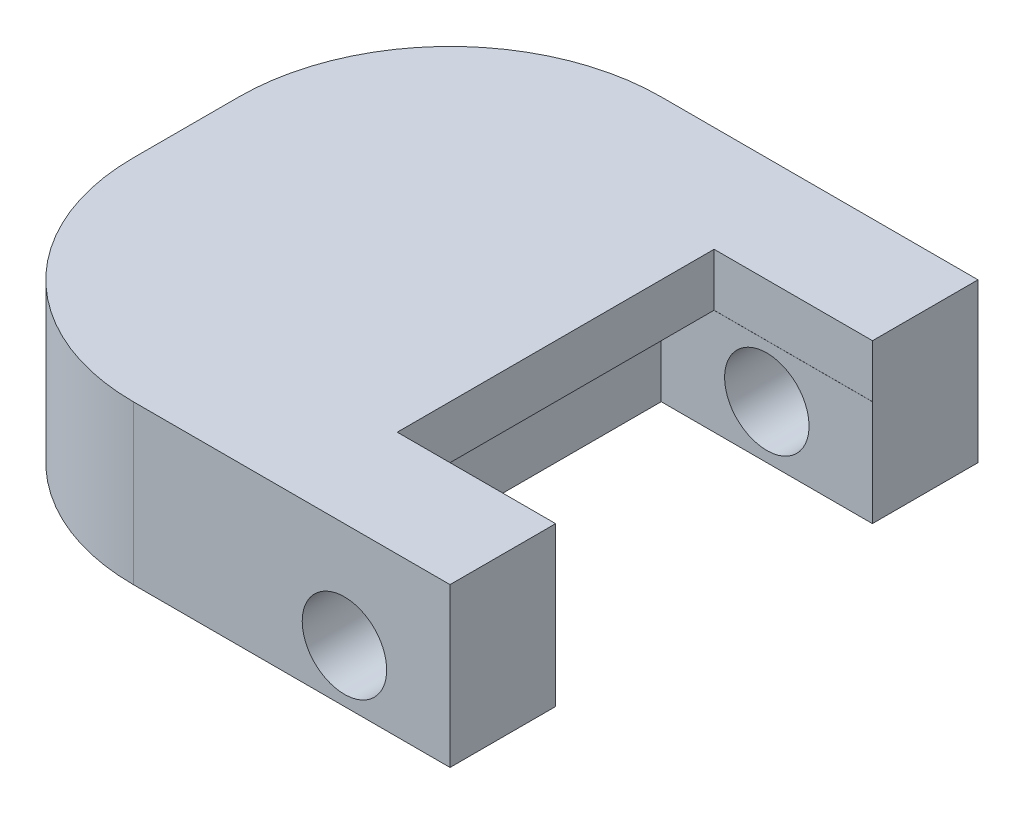
ISO-10303-21;
HEADER;
FILE_DESCRIPTION(('STEP AP214'),'2;1');
FILE_NAME('part.step','',(''),(''),'','','');
FILE_SCHEMA(('AUTOMOTIVE_DESIGN { 1 0 10303 214 1 1 1 1 }'));
ENDSEC;
DATA;
#1=APPLICATION_CONTEXT('core data for automotive mechanical design processes');
#2=APPLICATION_PROTOCOL_DEFINITION('international standard','automotive_design',2000,#1);
#3=PRODUCT_CONTEXT('',#1,'mechanical');
#4=PRODUCT('Part','Part','',(#3));
#5=PRODUCT_RELATED_PRODUCT_CATEGORY('part','',(#4));
#6=PRODUCT_DEFINITION_FORMATION('','',#4);
#7=PRODUCT_DEFINITION_CONTEXT('part definition',#1,'design');
#8=PRODUCT_DEFINITION('design','',#6,#7);
#9=PRODUCT_DEFINITION_SHAPE('','',#8);
#10=(LENGTH_UNIT() NAMED_UNIT(*) SI_UNIT(.MILLI.,.METRE.));
#11=(NAMED_UNIT(*) PLANE_ANGLE_UNIT() SI_UNIT($,.RADIAN.));
#12=(NAMED_UNIT(*) SI_UNIT($,.STERADIAN.) SOLID_ANGLE_UNIT());
#13=UNCERTAINTY_MEASURE_WITH_UNIT(LENGTH_MEASURE(1.E-05),#10,'distance_accuracy_value','');
#14=(GEOMETRIC_REPRESENTATION_CONTEXT(3) GLOBAL_UNCERTAINTY_ASSIGNED_CONTEXT((#13)) GLOBAL_UNIT_ASSIGNED_CONTEXT((#10,
#11,#12)) REPRESENTATION_CONTEXT('',''));
#15=CARTESIAN_POINT('',(0.,0.,0.));
#16=DIRECTION('',(0.,0.,1.));
#17=DIRECTION('',(1.,0.,0.));
#18=AXIS2_PLACEMENT_3D('',#15,#16,#17);
#19=CARTESIAN_POINT('',(63.5,38.1,-63.5));
#20=DIRECTION('',(-1.,0.,0.));
#21=DIRECTION('',(0.,0.,1.));
#22=AXIS2_PLACEMENT_3D('',#19,#20,#21);
#23=PLANE('',#22);
#24=DIRECTION('',(0.,-1.,0.));
#25=VECTOR('',#24,1.);
#26=CARTESIAN_POINT('',(63.5,25.4,38.1));
#27=LINE('',#26,#25);
#28=CARTESIAN_POINT('',(63.5,38.1,38.1));
#29=VERTEX_POINT('',#28);
#30=CARTESIAN_POINT('',(63.5,0.,38.1));
#31=VERTEX_POINT('',#30);
#32=EDGE_CURVE('E180',#29,#31,#27,.T.);
#33=ORIENTED_EDGE('',*,*,#32,.F.);
#34=DIRECTION('',(0.,0.,-1.));
#35=VECTOR('',#34,1.);
#36=CARTESIAN_POINT('',(63.5,38.1,-63.5));
#37=LINE('',#36,#35);
#38=CARTESIAN_POINT('',(63.5,38.1,63.5));
#39=VERTEX_POINT('',#38);
#40=EDGE_CURVE('E194',#39,#29,#37,.T.);
#41=ORIENTED_EDGE('',*,*,#40,.F.);
#42=DIRECTION('',(0.,-1.,0.));
#43=VECTOR('',#42,1.);
#44=CARTESIAN_POINT('',(63.5,38.1,63.5));
#45=LINE('',#44,#43);
#46=CARTESIAN_POINT('',(63.5,0.,63.5));
#47=VERTEX_POINT('',#46);
#48=EDGE_CURVE('E208',#39,#47,#45,.T.);
#49=ORIENTED_EDGE('',*,*,#48,.T.);
#50=DIRECTION('',(0.,0.,-1.));
#51=VECTOR('',#50,1.);
#52=CARTESIAN_POINT('',(63.5,0.,-63.5));
#53=LINE('',#52,#51);
#54=EDGE_CURVE('E209',#47,#31,#53,.T.);
#55=ORIENTED_EDGE('',*,*,#54,.T.);
#56=EDGE_LOOP('',(#33,#41,#49,#55));
#57=FACE_BOUND('',#56,.T.);
#58=ADVANCED_FACE('F36',(#57),#23,.F.);
#59=CARTESIAN_POINT('',(63.5,38.1,-38.123232364424));
#60=VERTEX_POINT('',#59);
#61=CARTESIAN_POINT('',(63.5,38.1,-63.5));
#62=VERTEX_POINT('',#61);
#63=EDGE_CURVE('E198',#60,#62,#37,.T.);
#64=ORIENTED_EDGE('',*,*,#63,.F.);
#65=DIRECTION('',(0.,1.,0.));
#66=VECTOR('',#65,1.);
#67=CARTESIAN_POINT('',(63.5,25.4,-38.123232364424));
#68=LINE('',#67,#66);
#69=CARTESIAN_POINT('',(63.5,25.4,-38.123232364424));
#70=VERTEX_POINT('',#69);
#71=EDGE_CURVE('E161',#70,#60,#68,.T.);
#72=ORIENTED_EDGE('',*,*,#71,.F.);
#73=DIRECTION('',(0.,0.,-1.));
#74=VECTOR('',#73,1.);
#75=CARTESIAN_POINT('',(63.5,25.4,38.1));
#76=LINE('',#75,#74);
#77=CARTESIAN_POINT('',(63.5,25.4,-38.1));
#78=VERTEX_POINT('',#77);
#79=EDGE_CURVE('E148',#78,#70,#76,.T.);
#80=ORIENTED_EDGE('',*,*,#79,.F.);
#81=DIRECTION('',(0.,1.,0.));
#82=VECTOR('',#81,1.);
#83=CARTESIAN_POINT('',(63.5,25.4,-38.1));
#84=LINE('',#83,#82);
#85=CARTESIAN_POINT('',(63.5,0.,-38.1));
#86=VERTEX_POINT('',#85);
#87=EDGE_CURVE('E176',#86,#78,#84,.T.);
#88=ORIENTED_EDGE('',*,*,#87,.F.);
#89=CARTESIAN_POINT('',(63.5,0.,-63.5));
#90=VERTEX_POINT('',#89);
#91=EDGE_CURVE('E190',#86,#90,#53,.T.);
#92=ORIENTED_EDGE('',*,*,#91,.T.);
#93=DIRECTION('',(0.,-1.,0.));
#94=VECTOR('',#93,1.);
#95=CARTESIAN_POINT('',(63.5,38.1,-63.5));
#96=LINE('',#95,#94);
#97=EDGE_CURVE('E236',#62,#90,#96,.T.);
#98=ORIENTED_EDGE('',*,*,#97,.F.);
#99=EDGE_LOOP('',(#64,#72,#80,#88,#92,#98));
#100=FACE_BOUND('',#99,.T.);
#101=ADVANCED_FACE('F38',(#100),#23,.F.);
#102=CARTESIAN_POINT('',(63.5,38.1,-63.5));
#103=DIRECTION('',(0.,0.,1.));
#104=DIRECTION('',(1.,0.,0.));
#105=AXIS2_PLACEMENT_3D('',#102,#103,#104);
#106=PLANE('',#105);
#107=CARTESIAN_POINT('',(38.1,12.7,-63.5));
#108=DIRECTION('',(0.,0.,-1.));
#109=DIRECTION('',(-1.,0.,0.));
#110=AXIS2_PLACEMENT_3D('',#107,#108,#109);
#111=CIRCLE('',#110,10.16);
#112=CARTESIAN_POINT('',(27.94,12.7,-63.5));
#113=VERTEX_POINT('',#112);
#114=EDGE_CURVE('E166',#113,#113,#111,.T.);
#115=ORIENTED_EDGE('',*,*,#114,.F.);
#116=EDGE_LOOP('',(#115));
#117=FACE_BOUND('',#116,.T.);
#118=DIRECTION('',(-1.,0.,0.));
#119=VECTOR('',#118,1.);
#120=CARTESIAN_POINT('',(63.5,0.,-63.5));
#121=LINE('',#120,#119);
#122=CARTESIAN_POINT('',(-12.7,0.,-63.5));
#123=VERTEX_POINT('',#122);
#124=EDGE_CURVE('E212',#90,#123,#121,.T.);
#125=ORIENTED_EDGE('',*,*,#124,.T.);
#126=DIRECTION('',(0.,-1.,0.));
#127=VECTOR('',#126,1.);
#128=CARTESIAN_POINT('',(-12.7,38.1,-63.5));
#129=LINE('',#128,#127);
#130=CARTESIAN_POINT('',(-12.7,38.1,-63.5));
#131=VERTEX_POINT('',#130);
#132=EDGE_CURVE('E233',#131,#123,#129,.T.);
#133=ORIENTED_EDGE('',*,*,#132,.F.);
#134=DIRECTION('',(-1.,0.,0.));
#135=VECTOR('',#134,1.);
#136=CARTESIAN_POINT('',(63.5,38.1,-63.5));
#137=LINE('',#136,#135);
#138=EDGE_CURVE('E197',#62,#131,#137,.T.);
#139=ORIENTED_EDGE('',*,*,#138,.F.);
#140=ORIENTED_EDGE('',*,*,#97,.T.);
#141=EDGE_LOOP('',(#125,#133,#139,#140));
#142=FACE_BOUND('',#141,.T.);
#143=ADVANCED_FACE('F288',(#117,#142),#106,.F.);
#144=CARTESIAN_POINT('',(-12.7,38.1,-12.7));
#145=DIRECTION('',(0.,-1.,0.));
#146=DIRECTION('',(0.,0.,-1.));
#147=AXIS2_PLACEMENT_3D('',#144,#145,#146);
#148=CYLINDRICAL_SURFACE('',#147,50.8);
#149=CARTESIAN_POINT('',(-12.7,0.,-12.7));
#150=DIRECTION('',(0.,1.,0.));
#151=DIRECTION('',(0.,0.,1.));
#152=AXIS2_PLACEMENT_3D('',#149,#150,#151);
#153=CIRCLE('',#152,50.8);
#154=CARTESIAN_POINT('',(-63.5,0.,-12.7));
#155=VERTEX_POINT('',#154);
#156=EDGE_CURVE('E214',#123,#155,#153,.T.);
#157=ORIENTED_EDGE('',*,*,#156,.T.);
#158=DIRECTION('',(0.,-1.,0.));
#159=VECTOR('',#158,1.);
#160=CARTESIAN_POINT('',(-63.5,38.1,-12.7));
#161=LINE('',#160,#159);
#162=CARTESIAN_POINT('',(-63.5,38.1,-12.7));
#163=VERTEX_POINT('',#162);
#164=EDGE_CURVE('E230',#163,#155,#161,.T.);
#165=ORIENTED_EDGE('',*,*,#164,.F.);
#166=CARTESIAN_POINT('',(-12.7,38.1,-12.7));
#167=DIRECTION('',(0.,1.,0.));
#168=DIRECTION('',(0.,0.,1.));
#169=AXIS2_PLACEMENT_3D('',#166,#167,#168);
#170=CIRCLE('',#169,50.8);
#171=EDGE_CURVE('E200',#131,#163,#170,.T.);
#172=ORIENTED_EDGE('',*,*,#171,.F.);
#173=ORIENTED_EDGE('',*,*,#132,.T.);
#174=EDGE_LOOP('',(#157,#165,#172,#173));
#175=FACE_BOUND('',#174,.T.);
#176=ADVANCED_FACE('F283',(#175),#148,.T.);
#177=CARTESIAN_POINT('',(-63.5,38.1,-12.7));
#178=DIRECTION('',(1.,0.,0.));
#179=DIRECTION('',(0.,0.,-1.));
#180=AXIS2_PLACEMENT_3D('',#177,#178,#179);
#181=PLANE('',#180);
#182=DIRECTION('',(0.,0.,1.));
#183=VECTOR('',#182,1.);
#184=CARTESIAN_POINT('',(-63.5,0.,-12.7));
#185=LINE('',#184,#183);
#186=CARTESIAN_POINT('',(-63.5,0.,12.7));
#187=VERTEX_POINT('',#186);
#188=EDGE_CURVE('E216',#155,#187,#185,.T.);
#189=ORIENTED_EDGE('',*,*,#188,.T.);
#190=DIRECTION('',(0.,-1.,0.));
#191=VECTOR('',#190,1.);
#192=CARTESIAN_POINT('',(-63.5,38.1,12.7));
#193=LINE('',#192,#191);
#194=CARTESIAN_POINT('',(-63.5,38.1,12.7));
#195=VERTEX_POINT('',#194);
#196=EDGE_CURVE('E227',#195,#187,#193,.T.);
#197=ORIENTED_EDGE('',*,*,#196,.F.);
#198=DIRECTION('',(0.,0.,1.));
#199=VECTOR('',#198,1.);
#200=CARTESIAN_POINT('',(-63.5,38.1,-12.7));
#201=LINE('',#200,#199);
#202=EDGE_CURVE('E202',#163,#195,#201,.T.);
#203=ORIENTED_EDGE('',*,*,#202,.F.);
#204=ORIENTED_EDGE('',*,*,#164,.T.);
#205=EDGE_LOOP('',(#189,#197,#203,#204));
#206=FACE_BOUND('',#205,.T.);
#207=ADVANCED_FACE('F278',(#206),#181,.F.);
#208=CARTESIAN_POINT('',(-12.7,38.1,12.7));
#209=DIRECTION('',(0.,-1.,0.));
#210=DIRECTION('',(0.,0.,-1.));
#211=AXIS2_PLACEMENT_3D('',#208,#209,#210);
#212=CYLINDRICAL_SURFACE('',#211,50.8);
#213=CARTESIAN_POINT('',(-12.7,0.,12.7));
#214=DIRECTION('',(0.,1.,0.));
#215=DIRECTION('',(0.,0.,-1.));
#216=AXIS2_PLACEMENT_3D('',#213,#214,#215);
#217=CIRCLE('',#216,50.8);
#218=CARTESIAN_POINT('',(-12.7,0.,63.5));
#219=VERTEX_POINT('',#218);
#220=EDGE_CURVE('E218',#187,#219,#217,.T.);
#221=ORIENTED_EDGE('',*,*,#220,.T.);
#222=DIRECTION('',(0.,-1.,0.));
#223=VECTOR('',#222,1.);
#224=CARTESIAN_POINT('',(-12.7,38.1,63.5));
#225=LINE('',#224,#223);
#226=CARTESIAN_POINT('',(-12.7,38.1,63.5));
#227=VERTEX_POINT('',#226);
#228=EDGE_CURVE('E224',#227,#219,#225,.T.);
#229=ORIENTED_EDGE('',*,*,#228,.F.);
#230=CARTESIAN_POINT('',(-12.7,38.1,12.7));
#231=DIRECTION('',(0.,1.,0.));
#232=DIRECTION('',(0.,0.,-1.));
#233=AXIS2_PLACEMENT_3D('',#230,#231,#232);
#234=CIRCLE('',#233,50.8);
#235=EDGE_CURVE('E204',#195,#227,#234,.T.);
#236=ORIENTED_EDGE('',*,*,#235,.F.);
#237=ORIENTED_EDGE('',*,*,#196,.T.);
#238=EDGE_LOOP('',(#221,#229,#236,#237));
#239=FACE_BOUND('',#238,.T.);
#240=ADVANCED_FACE('F274',(#239),#212,.T.);
#241=CARTESIAN_POINT('',(63.5,38.1,63.5));
#242=DIRECTION('',(0.,0.,-1.));
#243=DIRECTION('',(-1.,0.,0.));
#244=AXIS2_PLACEMENT_3D('',#241,#242,#243);
#245=PLANE('',#244);
#246=CARTESIAN_POINT('',(38.1,12.7,63.5));
#247=DIRECTION('',(0.,0.,-1.));
#248=DIRECTION('',(-1.,0.,0.));
#249=AXIS2_PLACEMENT_3D('',#246,#247,#248);
#250=CIRCLE('',#249,10.16);
#251=CARTESIAN_POINT('',(27.94,12.7,63.5));
#252=VERTEX_POINT('',#251);
#253=EDGE_CURVE('E170',#252,#252,#250,.T.);
#254=ORIENTED_EDGE('',*,*,#253,.T.);
#255=EDGE_LOOP('',(#254));
#256=FACE_BOUND('',#255,.T.);
#257=DIRECTION('',(1.,0.,0.));
#258=VECTOR('',#257,1.);
#259=CARTESIAN_POINT('',(63.5,0.,63.5));
#260=LINE('',#259,#258);
#261=EDGE_CURVE('E220',#219,#47,#260,.T.);
#262=ORIENTED_EDGE('',*,*,#261,.T.);
#263=ORIENTED_EDGE('',*,*,#48,.F.);
#264=DIRECTION('',(1.,0.,0.));
#265=VECTOR('',#264,1.);
#266=CARTESIAN_POINT('',(63.5,38.1,63.5));
#267=LINE('',#266,#265);
#268=EDGE_CURVE('E206',#227,#39,#267,.T.);
#269=ORIENTED_EDGE('',*,*,#268,.F.);
#270=ORIENTED_EDGE('',*,*,#228,.T.);
#271=EDGE_LOOP('',(#262,#263,#269,#270));
#272=FACE_BOUND('',#271,.T.);
#273=ADVANCED_FACE('F270',(#256,#272),#245,.F.);
#274=CARTESIAN_POINT('',(-12.7,38.1,12.7));
#275=DIRECTION('',(0.,-1.,0.));
#276=DIRECTION('',(0.,0.,-1.));
#277=AXIS2_PLACEMENT_3D('',#274,#275,#276);
#278=PLANE('',#277);
#279=ORIENTED_EDGE('',*,*,#40,.T.);
#280=DIRECTION('',(1.,0.,0.));
#281=VECTOR('',#280,1.);
#282=CARTESIAN_POINT('',(25.4,38.1,38.1));
#283=LINE('',#282,#281);
#284=CARTESIAN_POINT('',(25.4,38.1,38.1));
#285=VERTEX_POINT('',#284);
#286=EDGE_CURVE('E163',#285,#29,#283,.T.);
#287=ORIENTED_EDGE('',*,*,#286,.F.);
#288=DIRECTION('',(0.,0.,1.));
#289=VECTOR('',#288,1.);
#290=CARTESIAN_POINT('',(25.4,38.1,38.1));
#291=LINE('',#290,#289);
#292=CARTESIAN_POINT('',(25.4,38.1,-38.123232364424));
#293=VERTEX_POINT('',#292);
#294=EDGE_CURVE('E152',#293,#285,#291,.T.);
#295=ORIENTED_EDGE('',*,*,#294,.F.);
#296=DIRECTION('',(1.,0.,0.));
#297=VECTOR('',#296,1.);
#298=CARTESIAN_POINT('',(25.4,38.1,-38.123232364424));
#299=LINE('',#298,#297);
#300=EDGE_CURVE('E151',#293,#60,#299,.T.);
#301=ORIENTED_EDGE('',*,*,#300,.T.);
#302=ORIENTED_EDGE('',*,*,#63,.T.);
#303=ORIENTED_EDGE('',*,*,#138,.T.);
#304=ORIENTED_EDGE('',*,*,#171,.T.);
#305=ORIENTED_EDGE('',*,*,#202,.T.);
#306=ORIENTED_EDGE('',*,*,#235,.T.);
#307=ORIENTED_EDGE('',*,*,#268,.T.);
#308=EDGE_LOOP('',(#279,#287,#295,#301,#302,#303,#304,#305,#306,#307));
#309=FACE_BOUND('',#308,.T.);
#310=ADVANCED_FACE('F261',(#309),#278,.F.);
#311=CARTESIAN_POINT('',(-12.7,0.,12.7));
#312=DIRECTION('',(0.,-1.,0.));
#313=DIRECTION('',(0.,0.,-1.));
#314=AXIS2_PLACEMENT_3D('',#311,#312,#313);
#315=PLANE('',#314);
#316=DIRECTION('',(1.,0.,0.));
#317=VECTOR('',#316,1.);
#318=CARTESIAN_POINT('',(-12.7,0.,-38.1));
#319=LINE('',#318,#317);
#320=CARTESIAN_POINT('',(12.7,0.,-38.1));
#321=VERTEX_POINT('',#320);
#322=EDGE_CURVE('E11',#321,#86,#319,.T.);
#323=ORIENTED_EDGE('',*,*,#322,.F.);
#324=DIRECTION('',(0.,0.,1.));
#325=VECTOR('',#324,1.);
#326=CARTESIAN_POINT('',(12.7,0.,12.7));
#327=LINE('',#326,#325);
#328=CARTESIAN_POINT('',(12.7,0.,38.1));
#329=VERTEX_POINT('',#328);
#330=EDGE_CURVE('E239',#321,#329,#327,.T.);
#331=ORIENTED_EDGE('',*,*,#330,.T.);
#332=DIRECTION('',(-1.,0.,0.));
#333=VECTOR('',#332,1.);
#334=CARTESIAN_POINT('',(-12.7,0.,38.1));
#335=LINE('',#334,#333);
#336=EDGE_CURVE('E45',#31,#329,#335,.T.);
#337=ORIENTED_EDGE('',*,*,#336,.F.);
#338=ORIENTED_EDGE('',*,*,#54,.F.);
#339=ORIENTED_EDGE('',*,*,#261,.F.);
#340=ORIENTED_EDGE('',*,*,#220,.F.);
#341=ORIENTED_EDGE('',*,*,#188,.F.);
#342=ORIENTED_EDGE('',*,*,#156,.F.);
#343=ORIENTED_EDGE('',*,*,#124,.F.);
#344=ORIENTED_EDGE('',*,*,#91,.F.);
#345=EDGE_LOOP('',(#323,#331,#337,#338,#339,#340,#341,#342,#343,#344));
#346=FACE_BOUND('',#345,.T.);
#347=ADVANCED_FACE('F248',(#346),#315,.T.);
#348=CARTESIAN_POINT('',(12.7,25.4,-38.1));
#349=DIRECTION('',(0.,0.,-1.));
#350=DIRECTION('',(-1.,0.,0.));
#351=AXIS2_PLACEMENT_3D('',#348,#349,#350);
#352=PLANE('',#351);
#353=CARTESIAN_POINT('',(38.1,12.7,-38.1));
#354=DIRECTION('',(0.,0.,-1.));
#355=DIRECTION('',(-1.,0.,0.));
#356=AXIS2_PLACEMENT_3D('',#353,#354,#355);
#357=CIRCLE('',#356,10.16);
#358=CARTESIAN_POINT('',(27.94,12.7,-38.1));
#359=VERTEX_POINT('',#358);
#360=EDGE_CURVE('E173',#359,#359,#357,.T.);
#361=ORIENTED_EDGE('',*,*,#360,.T.);
#362=EDGE_LOOP('',(#361));
#363=FACE_BOUND('',#362,.T.);
#364=ORIENTED_EDGE('',*,*,#322,.T.);
#365=ORIENTED_EDGE('',*,*,#87,.T.);
#366=DIRECTION('',(1.,0.,0.));
#367=VECTOR('',#366,1.);
#368=CARTESIAN_POINT('',(12.7,25.4,-38.1));
#369=LINE('',#368,#367);
#370=CARTESIAN_POINT('',(25.4,25.4,-38.1));
#371=VERTEX_POINT('',#370);
#372=EDGE_CURVE('E183',#371,#78,#369,.T.);
#373=ORIENTED_EDGE('',*,*,#372,.F.);
#374=CARTESIAN_POINT('',(12.7,25.4,-38.1));
#375=VERTEX_POINT('',#374);
#376=EDGE_CURVE('E191',#375,#371,#369,.T.);
#377=ORIENTED_EDGE('',*,*,#376,.F.);
#378=DIRECTION('',(0.,1.,0.));
#379=VECTOR('',#378,1.);
#380=CARTESIAN_POINT('',(12.7,25.4,-38.1));
#381=LINE('',#380,#379);
#382=EDGE_CURVE('E177',#321,#375,#381,.T.);
#383=ORIENTED_EDGE('',*,*,#382,.F.);
#384=EDGE_LOOP('',(#364,#365,#373,#377,#383));
#385=FACE_BOUND('',#384,.T.);
#386=ADVANCED_FACE('F254',(#363,#385),#352,.F.);
#387=CARTESIAN_POINT('',(12.7,25.4,38.1));
#388=DIRECTION('',(0.,0.,1.));
#389=DIRECTION('',(1.,0.,0.));
#390=AXIS2_PLACEMENT_3D('',#387,#388,#389);
#391=PLANE('',#390);
#392=CARTESIAN_POINT('',(38.1,12.7,38.1));
#393=DIRECTION('',(0.,0.,1.));
#394=DIRECTION('',(1.,0.,0.));
#395=AXIS2_PLACEMENT_3D('',#392,#393,#394);
#396=CIRCLE('',#395,10.16);
#397=CARTESIAN_POINT('',(48.26,12.7,38.1));
#398=VERTEX_POINT('',#397);
#399=EDGE_CURVE('E40',#398,#398,#396,.T.);
#400=ORIENTED_EDGE('',*,*,#399,.T.);
#401=EDGE_LOOP('',(#400));
#402=FACE_BOUND('',#401,.T.);
#403=ORIENTED_EDGE('',*,*,#336,.T.);
#404=DIRECTION('',(0.,-1.,0.));
#405=VECTOR('',#404,1.);
#406=CARTESIAN_POINT('',(12.7,25.4,38.1));
#407=LINE('',#406,#405);
#408=CARTESIAN_POINT('',(12.7,25.4,38.1));
#409=VERTEX_POINT('',#408);
#410=EDGE_CURVE('E60',#409,#329,#407,.T.);
#411=ORIENTED_EDGE('',*,*,#410,.F.);
#412=DIRECTION('',(1.,0.,0.));
#413=VECTOR('',#412,1.);
#414=CARTESIAN_POINT('',(12.7,25.4,38.1));
#415=LINE('',#414,#413);
#416=CARTESIAN_POINT('',(25.4,25.4,38.1));
#417=VERTEX_POINT('',#416);
#418=EDGE_CURVE('E187',#409,#417,#415,.T.);
#419=ORIENTED_EDGE('',*,*,#418,.T.);
#420=DIRECTION('',(0.,-1.,0.));
#421=VECTOR('',#420,1.);
#422=CARTESIAN_POINT('',(25.4,25.4,38.1));
#423=LINE('',#422,#421);
#424=EDGE_CURVE('E52',#285,#417,#423,.T.);
#425=ORIENTED_EDGE('',*,*,#424,.F.);
#426=ORIENTED_EDGE('',*,*,#286,.T.);
#427=ORIENTED_EDGE('',*,*,#32,.T.);
#428=EDGE_LOOP('',(#403,#411,#419,#425,#426,#427));
#429=FACE_BOUND('',#428,.T.);
#430=ADVANCED_FACE('F244',(#402,#429),#391,.F.);
#431=CARTESIAN_POINT('',(12.7,25.4,38.1));
#432=DIRECTION('',(0.,1.,0.));
#433=DIRECTION('',(0.,0.,1.));
#434=AXIS2_PLACEMENT_3D('',#431,#432,#433);
#435=PLANE('',#434);
#436=ORIENTED_EDGE('',*,*,#376,.T.);
#437=DIRECTION('',(0.,0.,-1.));
#438=VECTOR('',#437,1.);
#439=CARTESIAN_POINT('',(25.4,25.4,38.1));
#440=LINE('',#439,#438);
#441=EDGE_CURVE('E140',#417,#371,#440,.T.);
#442=ORIENTED_EDGE('',*,*,#441,.F.);
#443=ORIENTED_EDGE('',*,*,#418,.F.);
#444=DIRECTION('',(0.,0.,1.));
#445=VECTOR('',#444,1.);
#446=CARTESIAN_POINT('',(12.7,25.4,38.1));
#447=LINE('',#446,#445);
#448=EDGE_CURVE('E179',#375,#409,#447,.T.);
#449=ORIENTED_EDGE('',*,*,#448,.F.);
#450=EDGE_LOOP('',(#436,#442,#443,#449));
#451=FACE_BOUND('',#450,.T.);
#452=ADVANCED_FACE('F258',(#451),#435,.F.);
#453=CARTESIAN_POINT('',(12.7,0.,0.));
#454=DIRECTION('',(1.,0.,0.));
#455=DIRECTION('',(0.,0.,-1.));
#456=AXIS2_PLACEMENT_3D('',#453,#454,#455);
#457=PLANE('',#456);
#458=ORIENTED_EDGE('',*,*,#382,.T.);
#459=ORIENTED_EDGE('',*,*,#448,.T.);
#460=ORIENTED_EDGE('',*,*,#410,.T.);
#461=ORIENTED_EDGE('',*,*,#330,.F.);
#462=EDGE_LOOP('',(#458,#459,#460,#461));
#463=FACE_BOUND('',#462,.T.);
#464=ADVANCED_FACE('F251',(#463),#457,.T.);
#465=CARTESIAN_POINT('',(38.1,12.7,63.5));
#466=DIRECTION('',(0.,0.,-1.));
#467=DIRECTION('',(-1.,0.,0.));
#468=AXIS2_PLACEMENT_3D('',#465,#466,#467);
#469=CYLINDRICAL_SURFACE('',#468,10.16);
#470=ORIENTED_EDGE('',*,*,#253,.F.);
#471=EDGE_LOOP('',(#470));
#472=FACE_BOUND('',#471,.T.);
#473=ORIENTED_EDGE('',*,*,#399,.F.);
#474=EDGE_LOOP('',(#473));
#475=FACE_BOUND('',#474,.T.);
#476=ADVANCED_FACE('F382',(#472,#475),#469,.F.);
#477=ORIENTED_EDGE('',*,*,#114,.T.);
#478=EDGE_LOOP('',(#477));
#479=FACE_BOUND('',#478,.T.);
#480=ORIENTED_EDGE('',*,*,#360,.F.);
#481=EDGE_LOOP('',(#480));
#482=FACE_BOUND('',#481,.T.);
#483=ADVANCED_FACE('F307',(#479,#482),#469,.F.);
#484=CARTESIAN_POINT('',(25.4,25.4,38.1));
#485=DIRECTION('',(0.,-1.,0.));
#486=DIRECTION('',(0.,0.,-1.));
#487=AXIS2_PLACEMENT_3D('',#484,#485,#486);
#488=PLANE('',#487);
#489=ORIENTED_EDGE('',*,*,#79,.T.);
#490=DIRECTION('',(1.,0.,0.));
#491=VECTOR('',#490,1.);
#492=CARTESIAN_POINT('',(25.4,25.4,-38.123232364424));
#493=LINE('',#492,#491);
#494=CARTESIAN_POINT('',(25.4,25.4,-38.123232364424));
#495=VERTEX_POINT('',#494);
#496=EDGE_CURVE('E145',#495,#70,#493,.T.);
#497=ORIENTED_EDGE('',*,*,#496,.F.);
#498=EDGE_CURVE('E134',#371,#495,#440,.T.);
#499=ORIENTED_EDGE('',*,*,#498,.F.);
#500=ORIENTED_EDGE('',*,*,#372,.T.);
#501=EDGE_LOOP('',(#489,#497,#499,#500));
#502=FACE_BOUND('',#501,.T.);
#503=ADVANCED_FACE('F146',(#502),#488,.F.);
#504=CARTESIAN_POINT('',(25.4,25.4,-38.123232364424));
#505=DIRECTION('',(0.,0.,-1.));
#506=DIRECTION('',(-1.,0.,0.));
#507=AXIS2_PLACEMENT_3D('',#504,#505,#506);
#508=PLANE('',#507);
#509=ORIENTED_EDGE('',*,*,#71,.T.);
#510=ORIENTED_EDGE('',*,*,#300,.F.);
#511=DIRECTION('',(0.,1.,0.));
#512=VECTOR('',#511,1.);
#513=CARTESIAN_POINT('',(25.4,25.4,-38.123232364424));
#514=LINE('',#513,#512);
#515=EDGE_CURVE('E138',#495,#293,#514,.T.);
#516=ORIENTED_EDGE('',*,*,#515,.F.);
#517=ORIENTED_EDGE('',*,*,#496,.T.);
#518=EDGE_LOOP('',(#509,#510,#516,#517));
#519=FACE_BOUND('',#518,.T.);
#520=ADVANCED_FACE('F154',(#519),#508,.F.);
#521=CARTESIAN_POINT('',(25.4,0.,0.));
#522=DIRECTION('',(-1.,0.,0.));
#523=DIRECTION('',(0.,0.,1.));
#524=AXIS2_PLACEMENT_3D('',#521,#522,#523);
#525=PLANE('',#524);
#526=ORIENTED_EDGE('',*,*,#424,.T.);
#527=ORIENTED_EDGE('',*,*,#441,.T.);
#528=ORIENTED_EDGE('',*,*,#498,.T.);
#529=ORIENTED_EDGE('',*,*,#515,.T.);
#530=ORIENTED_EDGE('',*,*,#294,.T.);
#531=EDGE_LOOP('',(#526,#527,#528,#529,#530));
#532=FACE_BOUND('',#531,.T.);
#533=ADVANCED_FACE('F136',(#532),#525,.F.);
#534=CLOSED_SHELL('',(#58,#101,#143,#176,#207,#240,#273,#310,#347,#386,#430,#452,#464,#476,#483,
#503,#520,#533));
#535=MANIFOLD_SOLID_BREP('B2',#534);
#536=ADVANCED_BREP_SHAPE_REPRESENTATION('',(#18,#535),#14);
#537=SHAPE_DEFINITION_REPRESENTATION(#9,#536);
ENDSEC;
END-ISO-10303-21;
